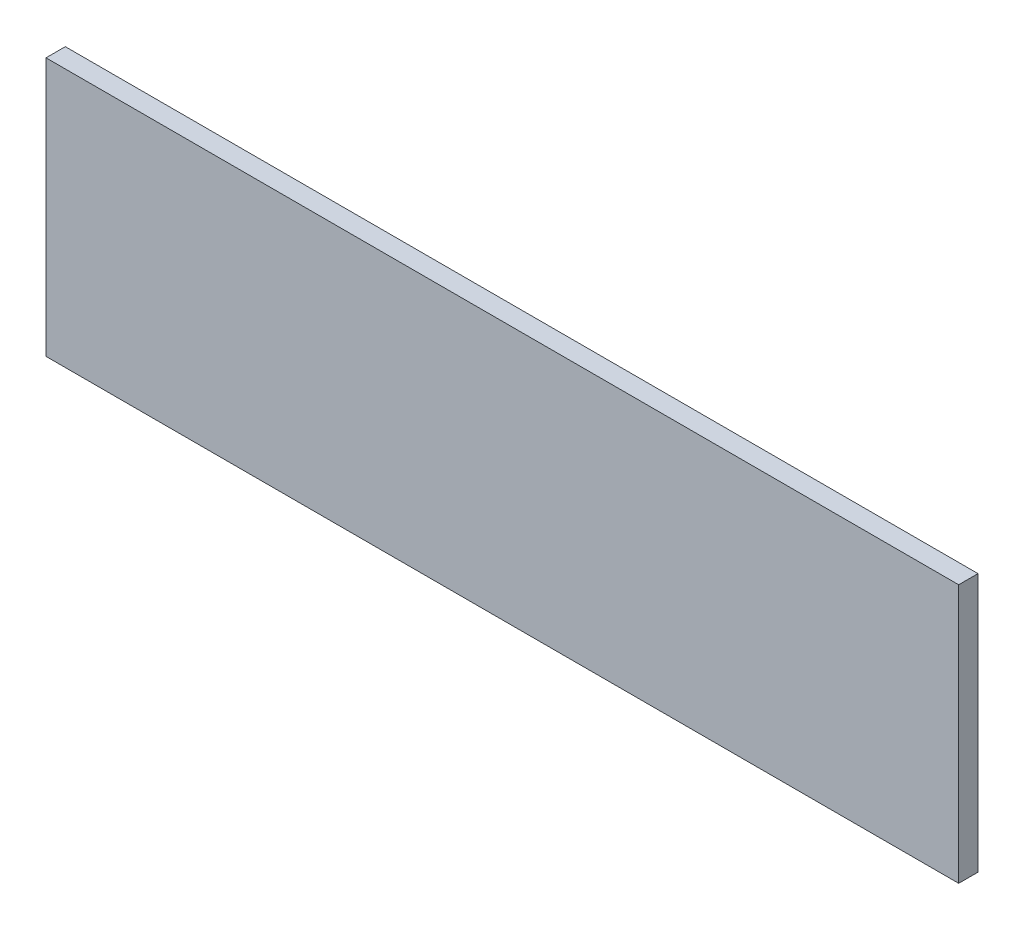
ISO-10303-21;
HEADER;
FILE_DESCRIPTION(('STEP AP214'),'2;1');
FILE_NAME('part.step','',(''),(''),'','','');
FILE_SCHEMA(('AUTOMOTIVE_DESIGN { 1 0 10303 214 1 1 1 1 }'));
ENDSEC;
DATA;
#1=APPLICATION_CONTEXT('core data for automotive mechanical design processes');
#2=APPLICATION_PROTOCOL_DEFINITION('international standard','automotive_design',2000,#1);
#3=PRODUCT_CONTEXT('',#1,'mechanical');
#4=PRODUCT('Part','Part','',(#3));
#5=PRODUCT_RELATED_PRODUCT_CATEGORY('part','',(#4));
#6=PRODUCT_DEFINITION_FORMATION('','',#4);
#7=PRODUCT_DEFINITION_CONTEXT('part definition',#1,'design');
#8=PRODUCT_DEFINITION('design','',#6,#7);
#9=PRODUCT_DEFINITION_SHAPE('','',#8);
#10=(LENGTH_UNIT() NAMED_UNIT(*) SI_UNIT(.MILLI.,.METRE.));
#11=(NAMED_UNIT(*) PLANE_ANGLE_UNIT() SI_UNIT($,.RADIAN.));
#12=(NAMED_UNIT(*) SI_UNIT($,.STERADIAN.) SOLID_ANGLE_UNIT());
#13=UNCERTAINTY_MEASURE_WITH_UNIT(LENGTH_MEASURE(1.E-05),#10,'distance_accuracy_value','');
#14=(GEOMETRIC_REPRESENTATION_CONTEXT(3) GLOBAL_UNCERTAINTY_ASSIGNED_CONTEXT((#13)) GLOBAL_UNIT_ASSIGNED_CONTEXT((#10,
#11,#12)) REPRESENTATION_CONTEXT('',''));
#15=CARTESIAN_POINT('',(0.,0.,0.));
#16=DIRECTION('',(0.,0.,1.));
#17=DIRECTION('',(1.,0.,0.));
#18=AXIS2_PLACEMENT_3D('',#15,#16,#17);
#19=CARTESIAN_POINT('',(300.,-85.,12.7));
#20=DIRECTION('',(-1.,0.,0.));
#21=DIRECTION('',(0.,0.,1.));
#22=AXIS2_PLACEMENT_3D('',#19,#20,#21);
#23=PLANE('',#22);
#24=DIRECTION('',(0.,1.,0.));
#25=VECTOR('',#24,1.);
#26=CARTESIAN_POINT('',(300.,-85.,0.));
#27=LINE('',#26,#25);
#28=CARTESIAN_POINT('',(300.,-85.,0.));
#29=VERTEX_POINT('',#28);
#30=CARTESIAN_POINT('',(300.,85.,0.));
#31=VERTEX_POINT('',#30);
#32=EDGE_CURVE('E96',#29,#31,#27,.T.);
#33=ORIENTED_EDGE('',*,*,#32,.T.);
#34=DIRECTION('',(0.,0.,-1.));
#35=VECTOR('',#34,1.);
#36=CARTESIAN_POINT('',(300.,85.,12.7));
#37=LINE('',#36,#35);
#38=CARTESIAN_POINT('',(300.,85.,12.7));
#39=VERTEX_POINT('',#38);
#40=EDGE_CURVE('E11',#39,#31,#37,.T.);
#41=ORIENTED_EDGE('',*,*,#40,.F.);
#42=DIRECTION('',(0.,1.,0.));
#43=VECTOR('',#42,1.);
#44=CARTESIAN_POINT('',(300.,-85.,12.7));
#45=LINE('',#44,#43);
#46=CARTESIAN_POINT('',(300.,-85.,12.7));
#47=VERTEX_POINT('',#46);
#48=EDGE_CURVE('E84',#47,#39,#45,.T.);
#49=ORIENTED_EDGE('',*,*,#48,.F.);
#50=DIRECTION('',(0.,0.,-1.));
#51=VECTOR('',#50,1.);
#52=CARTESIAN_POINT('',(300.,-85.,12.7));
#53=LINE('',#52,#51);
#54=EDGE_CURVE('E92',#47,#29,#53,.T.);
#55=ORIENTED_EDGE('',*,*,#54,.T.);
#56=EDGE_LOOP('',(#33,#41,#49,#55));
#57=FACE_BOUND('',#56,.T.);
#58=ADVANCED_FACE('F33',(#57),#23,.F.);
#59=CARTESIAN_POINT('',(-300.,85.,12.7));
#60=DIRECTION('',(0.,-1.,0.));
#61=DIRECTION('',(0.,0.,-1.));
#62=AXIS2_PLACEMENT_3D('',#59,#60,#61);
#63=PLANE('',#62);
#64=DIRECTION('',(-1.,0.,0.));
#65=VECTOR('',#64,1.);
#66=CARTESIAN_POINT('',(-300.,85.,0.));
#67=LINE('',#66,#65);
#68=CARTESIAN_POINT('',(-300.,85.,0.));
#69=VERTEX_POINT('',#68);
#70=EDGE_CURVE('E88',#31,#69,#67,.T.);
#71=ORIENTED_EDGE('',*,*,#70,.T.);
#72=DIRECTION('',(0.,0.,-1.));
#73=VECTOR('',#72,1.);
#74=CARTESIAN_POINT('',(-300.,85.,12.7));
#75=LINE('',#74,#73);
#76=CARTESIAN_POINT('',(-300.,85.,12.7));
#77=VERTEX_POINT('',#76);
#78=EDGE_CURVE('E41',#77,#69,#75,.T.);
#79=ORIENTED_EDGE('',*,*,#78,.F.);
#80=DIRECTION('',(-1.,0.,0.));
#81=VECTOR('',#80,1.);
#82=CARTESIAN_POINT('',(-300.,85.,12.7));
#83=LINE('',#82,#81);
#84=EDGE_CURVE('E79',#39,#77,#83,.T.);
#85=ORIENTED_EDGE('',*,*,#84,.F.);
#86=ORIENTED_EDGE('',*,*,#40,.T.);
#87=EDGE_LOOP('',(#71,#79,#85,#86));
#88=FACE_BOUND('',#87,.T.);
#89=ADVANCED_FACE('F87',(#88),#63,.F.);
#90=CARTESIAN_POINT('',(-300.,-85.,12.7));
#91=DIRECTION('',(1.,0.,0.));
#92=DIRECTION('',(0.,0.,-1.));
#93=AXIS2_PLACEMENT_3D('',#90,#91,#92);
#94=PLANE('',#93);
#95=DIRECTION('',(0.,-1.,0.));
#96=VECTOR('',#95,1.);
#97=CARTESIAN_POINT('',(-300.,-85.,0.));
#98=LINE('',#97,#96);
#99=CARTESIAN_POINT('',(-300.,-85.,0.));
#100=VERTEX_POINT('',#99);
#101=EDGE_CURVE('E66',#69,#100,#98,.T.);
#102=ORIENTED_EDGE('',*,*,#101,.T.);
#103=DIRECTION('',(0.,0.,-1.));
#104=VECTOR('',#103,1.);
#105=CARTESIAN_POINT('',(-300.,-85.,12.7));
#106=LINE('',#105,#104);
#107=CARTESIAN_POINT('',(-300.,-85.,12.7));
#108=VERTEX_POINT('',#107);
#109=EDGE_CURVE('E89',#108,#100,#106,.T.);
#110=ORIENTED_EDGE('',*,*,#109,.F.);
#111=DIRECTION('',(0.,-1.,0.));
#112=VECTOR('',#111,1.);
#113=CARTESIAN_POINT('',(-300.,-85.,12.7));
#114=LINE('',#113,#112);
#115=EDGE_CURVE('E82',#77,#108,#114,.T.);
#116=ORIENTED_EDGE('',*,*,#115,.F.);
#117=ORIENTED_EDGE('',*,*,#78,.T.);
#118=EDGE_LOOP('',(#102,#110,#116,#117));
#119=FACE_BOUND('',#118,.T.);
#120=ADVANCED_FACE('F90',(#119),#94,.F.);
#121=CARTESIAN_POINT('',(-300.,-85.,12.7));
#122=DIRECTION('',(0.,1.,0.));
#123=DIRECTION('',(0.,0.,1.));
#124=AXIS2_PLACEMENT_3D('',#121,#122,#123);
#125=PLANE('',#124);
#126=DIRECTION('',(1.,0.,0.));
#127=VECTOR('',#126,1.);
#128=CARTESIAN_POINT('',(-300.,-85.,0.));
#129=LINE('',#128,#127);
#130=EDGE_CURVE('E72',#100,#29,#129,.T.);
#131=ORIENTED_EDGE('',*,*,#130,.T.);
#132=ORIENTED_EDGE('',*,*,#54,.F.);
#133=DIRECTION('',(1.,0.,0.));
#134=VECTOR('',#133,1.);
#135=CARTESIAN_POINT('',(-300.,-85.,12.7));
#136=LINE('',#135,#134);
#137=EDGE_CURVE('E49',#108,#47,#136,.T.);
#138=ORIENTED_EDGE('',*,*,#137,.F.);
#139=ORIENTED_EDGE('',*,*,#109,.T.);
#140=EDGE_LOOP('',(#131,#132,#138,#139));
#141=FACE_BOUND('',#140,.T.);
#142=ADVANCED_FACE('F103',(#141),#125,.F.);
#143=CARTESIAN_POINT('',(0.,0.,12.7));
#144=DIRECTION('',(0.,0.,-1.));
#145=DIRECTION('',(-1.,0.,0.));
#146=AXIS2_PLACEMENT_3D('',#143,#144,#145);
#147=PLANE('',#146);
#148=ORIENTED_EDGE('',*,*,#48,.T.);
#149=ORIENTED_EDGE('',*,*,#84,.T.);
#150=ORIENTED_EDGE('',*,*,#115,.T.);
#151=ORIENTED_EDGE('',*,*,#137,.T.);
#152=EDGE_LOOP('',(#148,#149,#150,#151));
#153=FACE_BOUND('',#152,.T.);
#154=ADVANCED_FACE('F80',(#153),#147,.F.);
#155=CARTESIAN_POINT('',(0.,0.,0.));
#156=DIRECTION('',(0.,0.,-1.));
#157=DIRECTION('',(-1.,0.,0.));
#158=AXIS2_PLACEMENT_3D('',#155,#156,#157);
#159=PLANE('',#158);
#160=ORIENTED_EDGE('',*,*,#32,.F.);
#161=ORIENTED_EDGE('',*,*,#130,.F.);
#162=ORIENTED_EDGE('',*,*,#101,.F.);
#163=ORIENTED_EDGE('',*,*,#70,.F.);
#164=EDGE_LOOP('',(#160,#161,#162,#163));
#165=FACE_BOUND('',#164,.T.);
#166=ADVANCED_FACE('F106',(#165),#159,.T.);
#167=CLOSED_SHELL('',(#58,#89,#120,#142,#154,#166));
#168=MANIFOLD_SOLID_BREP('B2',#167);
#169=ADVANCED_BREP_SHAPE_REPRESENTATION('',(#18,#168),#14);
#170=SHAPE_DEFINITION_REPRESENTATION(#9,#169);
ENDSEC;
END-ISO-10303-21;
